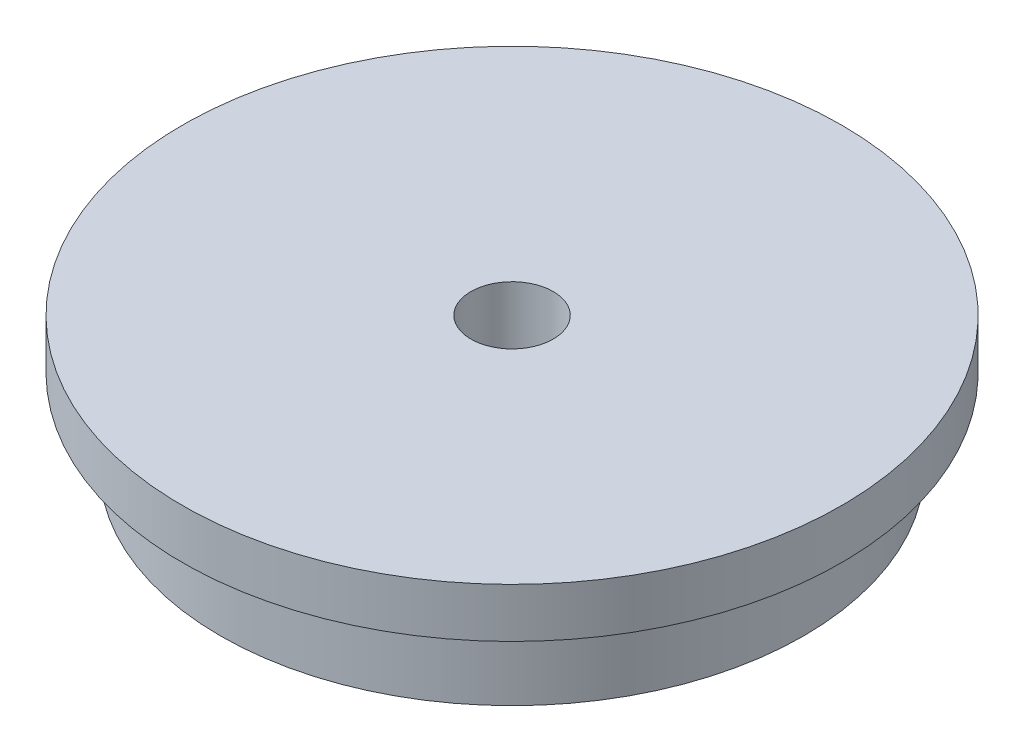
ISO-10303-21;
HEADER;
FILE_DESCRIPTION(('STEP AP214'),'2;1');
FILE_NAME('part.step','',(''),(''),'','','');
FILE_SCHEMA(('AUTOMOTIVE_DESIGN { 1 0 10303 214 1 1 1 1 }'));
ENDSEC;
DATA;
#1=APPLICATION_CONTEXT('core data for automotive mechanical design processes');
#2=APPLICATION_PROTOCOL_DEFINITION('international standard','automotive_design',2000,#1);
#3=PRODUCT_CONTEXT('',#1,'mechanical');
#4=PRODUCT('Part','Part','',(#3));
#5=PRODUCT_RELATED_PRODUCT_CATEGORY('part','',(#4));
#6=PRODUCT_DEFINITION_FORMATION('','',#4);
#7=PRODUCT_DEFINITION_CONTEXT('part definition',#1,'design');
#8=PRODUCT_DEFINITION('design','',#6,#7);
#9=PRODUCT_DEFINITION_SHAPE('','',#8);
#10=(LENGTH_UNIT() NAMED_UNIT(*) SI_UNIT(.MILLI.,.METRE.));
#11=(NAMED_UNIT(*) PLANE_ANGLE_UNIT() SI_UNIT($,.RADIAN.));
#12=(NAMED_UNIT(*) SI_UNIT($,.STERADIAN.) SOLID_ANGLE_UNIT());
#13=UNCERTAINTY_MEASURE_WITH_UNIT(LENGTH_MEASURE(1.E-05),#10,'distance_accuracy_value','');
#14=(GEOMETRIC_REPRESENTATION_CONTEXT(3) GLOBAL_UNCERTAINTY_ASSIGNED_CONTEXT((#13)) GLOBAL_UNIT_ASSIGNED_CONTEXT((#10,
#11,#12)) REPRESENTATION_CONTEXT('',''));
#15=CARTESIAN_POINT('',(0.,0.,0.));
#16=DIRECTION('',(0.,0.,1.));
#17=DIRECTION('',(1.,0.,0.));
#18=AXIS2_PLACEMENT_3D('',#15,#16,#17);
#19=CARTESIAN_POINT('',(0.,6.35,0.));
#20=DIRECTION('',(0.,-1.,0.));
#21=DIRECTION('',(0.,0.,-1.));
#22=AXIS2_PLACEMENT_3D('',#19,#20,#21);
#23=CYLINDRICAL_SURFACE('',#22,22.479);
#24=CARTESIAN_POINT('',(0.,6.35,0.));
#25=DIRECTION('',(0.,1.,0.));
#26=DIRECTION('',(0.,0.,1.));
#27=AXIS2_PLACEMENT_3D('',#24,#25,#26);
#28=CIRCLE('',#27,22.479);
#29=CARTESIAN_POINT('',(0.,6.35,22.479));
#30=VERTEX_POINT('',#29);
#31=EDGE_CURVE('E10',#30,#30,#28,.T.);
#32=ORIENTED_EDGE('',*,*,#31,.F.);
#33=EDGE_LOOP('',(#32));
#34=FACE_BOUND('',#33,.T.);
#35=CARTESIAN_POINT('',(0.,0.,0.));
#36=DIRECTION('',(0.,1.,0.));
#37=DIRECTION('',(0.,0.,1.));
#38=AXIS2_PLACEMENT_3D('',#35,#36,#37);
#39=CIRCLE('',#38,22.479);
#40=CARTESIAN_POINT('',(0.,0.,22.479));
#41=VERTEX_POINT('',#40);
#42=EDGE_CURVE('E42',#41,#41,#39,.T.);
#43=ORIENTED_EDGE('',*,*,#42,.T.);
#44=EDGE_LOOP('',(#43));
#45=FACE_BOUND('',#44,.T.);
#46=ADVANCED_FACE('F39',(#34,#45),#23,.T.);
#47=CARTESIAN_POINT('',(0.,0.,0.));
#48=DIRECTION('',(0.,1.,0.));
#49=DIRECTION('',(0.,0.,1.));
#50=AXIS2_PLACEMENT_3D('',#47,#48,#49);
#51=PLANE('',#50);
#52=CARTESIAN_POINT('',(0.,0.,0.));
#53=DIRECTION('',(0.,-1.,0.));
#54=DIRECTION('',(0.,0.,-1.));
#55=AXIS2_PLACEMENT_3D('',#52,#53,#54);
#56=CIRCLE('',#55,8.9916);
#57=CARTESIAN_POINT('',(0.,0.,-8.9916));
#58=VERTEX_POINT('',#57);
#59=EDGE_CURVE('E57',#58,#58,#56,.T.);
#60=ORIENTED_EDGE('',*,*,#59,.F.);
#61=EDGE_LOOP('',(#60));
#62=FACE_BOUND('',#61,.T.);
#63=ORIENTED_EDGE('',*,*,#42,.F.);
#64=EDGE_LOOP('',(#63));
#65=FACE_BOUND('',#64,.T.);
#66=ADVANCED_FACE('F91',(#62,#65),#51,.F.);
#67=CARTESIAN_POINT('',(0.,10.16,0.));
#68=DIRECTION('',(0.,-1.,0.));
#69=DIRECTION('',(0.,0.,-1.));
#70=AXIS2_PLACEMENT_3D('',#67,#68,#69);
#71=CYLINDRICAL_SURFACE('',#70,25.4);
#72=CARTESIAN_POINT('',(0.,10.16,0.));
#73=DIRECTION('',(0.,1.,0.));
#74=DIRECTION('',(0.,0.,1.));
#75=AXIS2_PLACEMENT_3D('',#72,#73,#74);
#76=CIRCLE('',#75,25.4);
#77=CARTESIAN_POINT('',(0.,10.16,-25.4));
#78=VERTEX_POINT('',#77);
#79=EDGE_CURVE('E49',#78,#78,#76,.T.);
#80=CARTESIAN_POINT('',(0.,6.35,0.));
#81=DIRECTION('',(0.,1.,0.));
#82=DIRECTION('',(0.,0.,1.));
#83=AXIS2_PLACEMENT_3D('',#80,#81,#82);
#84=CIRCLE('',#83,25.4);
#85=CARTESIAN_POINT('',(0.,6.35,-25.4));
#86=VERTEX_POINT('',#85);
#87=EDGE_CURVE('E51',#86,#86,#84,.T.);
#88=CARTESIAN_POINT('',(0.,10.16,-25.4));
#89=CARTESIAN_POINT('',(0.,10.1203125,-25.4));
#90=CARTESIAN_POINT('',(0.,10.080625,-25.4));
#91=CARTESIAN_POINT('',(0.,10.00125,-25.4));
#92=CARTESIAN_POINT('',(0.,9.9615625,-25.4));
#93=CARTESIAN_POINT('',(0.,9.8821875,-25.4));
#94=CARTESIAN_POINT('',(0.,9.8425,-25.4));
#95=CARTESIAN_POINT('',(0.,9.763125,-25.4));
#96=CARTESIAN_POINT('',(0.,9.7234375,-25.4));
#97=CARTESIAN_POINT('',(0.,9.6440625,-25.4));
#98=CARTESIAN_POINT('',(0.,9.604375,-25.4));
#99=CARTESIAN_POINT('',(0.,9.525,-25.4));
#100=CARTESIAN_POINT('',(0.,9.4853125,-25.4));
#101=CARTESIAN_POINT('',(0.,9.4059375,-25.4));
#102=CARTESIAN_POINT('',(0.,9.36625,-25.4));
#103=CARTESIAN_POINT('',(0.,9.286875,-25.4));
#104=CARTESIAN_POINT('',(0.,9.2471875,-25.4));
#105=CARTESIAN_POINT('',(0.,9.1678125,-25.4));
#106=CARTESIAN_POINT('',(0.,9.128125,-25.4));
#107=CARTESIAN_POINT('',(0.,9.04875,-25.4));
#108=CARTESIAN_POINT('',(0.,9.0090625,-25.4));
#109=CARTESIAN_POINT('',(0.,8.9296875,-25.4));
#110=CARTESIAN_POINT('',(0.,8.89,-25.4));
#111=CARTESIAN_POINT('',(0.,8.810625,-25.4));
#112=CARTESIAN_POINT('',(0.,8.7709375,-25.4));
#113=CARTESIAN_POINT('',(0.,8.6915625,-25.4));
#114=CARTESIAN_POINT('',(0.,8.651875,-25.4));
#115=CARTESIAN_POINT('',(0.,8.5725,-25.4));
#116=CARTESIAN_POINT('',(0.,8.5328125,-25.4));
#117=CARTESIAN_POINT('',(0.,8.4534375,-25.4));
#118=CARTESIAN_POINT('',(0.,8.41375,-25.4));
#119=CARTESIAN_POINT('',(0.,8.334375,-25.4));
#120=CARTESIAN_POINT('',(0.,8.2946875,-25.4));
#121=CARTESIAN_POINT('',(0.,8.2153125,-25.4));
#122=CARTESIAN_POINT('',(0.,8.175625,-25.4));
#123=CARTESIAN_POINT('',(0.,8.09625,-25.4));
#124=CARTESIAN_POINT('',(0.,8.0565625,-25.4));
#125=CARTESIAN_POINT('',(0.,7.9771875,-25.4));
#126=CARTESIAN_POINT('',(0.,7.9375,-25.4));
#127=CARTESIAN_POINT('',(0.,7.858125,-25.4));
#128=CARTESIAN_POINT('',(0.,7.8184375,-25.4));
#129=CARTESIAN_POINT('',(0.,7.7390625,-25.4));
#130=CARTESIAN_POINT('',(0.,7.699375,-25.4));
#131=CARTESIAN_POINT('',(0.,7.62,-25.4));
#132=CARTESIAN_POINT('',(0.,7.5803125,-25.4));
#133=CARTESIAN_POINT('',(0.,7.5009375,-25.4));
#134=CARTESIAN_POINT('',(0.,7.46125,-25.4));
#135=CARTESIAN_POINT('',(0.,7.381875,-25.4));
#136=CARTESIAN_POINT('',(0.,7.3421875,-25.4));
#137=CARTESIAN_POINT('',(0.,7.2628125,-25.4));
#138=CARTESIAN_POINT('',(0.,7.223125,-25.4));
#139=CARTESIAN_POINT('',(0.,7.14375,-25.4));
#140=CARTESIAN_POINT('',(0.,7.1040625,-25.4));
#141=CARTESIAN_POINT('',(0.,7.0246875,-25.4));
#142=CARTESIAN_POINT('',(0.,6.985,-25.4));
#143=CARTESIAN_POINT('',(0.,6.905625,-25.4));
#144=CARTESIAN_POINT('',(0.,6.8659375,-25.4));
#145=CARTESIAN_POINT('',(0.,6.7865625,-25.4));
#146=CARTESIAN_POINT('',(0.,6.746875,-25.4));
#147=CARTESIAN_POINT('',(0.,6.6675,-25.4));
#148=CARTESIAN_POINT('',(0.,6.6278125,-25.4));
#149=CARTESIAN_POINT('',(0.,6.5484375,-25.4));
#150=CARTESIAN_POINT('',(0.,6.50875,-25.4));
#151=CARTESIAN_POINT('',(0.,6.429375,-25.4));
#152=CARTESIAN_POINT('',(0.,6.3896875,-25.4));
#153=CARTESIAN_POINT('',(0.,6.35,-25.4));
#154=B_SPLINE_CURVE_WITH_KNOTS('',3,(#88,#89,#90,#91,#92,#93,#94,#95,#96,#97,#98,#99,#100,#101,
#102,#103,#104,#105,#106,#107,#108,#109,#110,#111,#112,#113,#114,#115,#116,#117,#118,#119,#120,
#121,#122,#123,#124,#125,#126,#127,#128,#129,#130,#131,#132,#133,#134,#135,#136,#137,#138,#139,
#140,#141,#142,#143,#144,#145,#146,#147,#148,#149,#150,#151,#152,#153),.UNSPECIFIED.,.F.,.F.,(4,
2,2,2,2,2,2,2,2,2,2,2,2,2,2,2,2,2,2,2,2,2,2,2,2,2,2,2,2,2,2,2,4),(0.,0.119062499999999,
0.238124999999999,0.3571875,0.476249999999999,0.595312499999999,0.714374999999998,
0.833437499999999,0.952499999999998,1.0715625,1.190625,1.3096875,1.42875,1.5478125,1.666875,
1.7859375,1.905,2.0240625,2.143125,2.2621875,2.38125,2.5003125,2.619375,2.7384375,2.8575,
2.9765625,3.095625,3.2146875,3.33375,3.4528125,3.571875,3.6909375,3.81),.UNSPECIFIED.);
#155=EDGE_CURVE('BSEAM94',#78,#86,#154,.T.);
#156=ORIENTED_EDGE('',*,*,#79,.F.);
#157=ORIENTED_EDGE('',*,*,#87,.T.);
#158=ORIENTED_EDGE('',*,*,#155,.T.);
#159=ORIENTED_EDGE('',*,*,#155,.F.);
#160=EDGE_LOOP('',(#156,#158,#157,#159));
#161=FACE_BOUND('',#160,.T.);
#162=ADVANCED_FACE('F94',(#161),#71,.T.);
#163=CARTESIAN_POINT('',(0.,10.16,0.));
#164=DIRECTION('',(0.,1.,0.));
#165=DIRECTION('',(0.,0.,1.));
#166=AXIS2_PLACEMENT_3D('',#163,#164,#165);
#167=PLANE('',#166);
#168=CARTESIAN_POINT('',(0.,10.16,0.));
#169=DIRECTION('',(0.,-1.,0.));
#170=DIRECTION('',(0.,0.,-1.));
#171=AXIS2_PLACEMENT_3D('',#168,#169,#170);
#172=CIRCLE('',#171,3.175);
#173=CARTESIAN_POINT('',(0.,10.16,-3.175));
#174=VERTEX_POINT('',#173);
#175=EDGE_CURVE('E60',#174,#174,#172,.T.);
#176=ORIENTED_EDGE('',*,*,#175,.T.);
#177=EDGE_LOOP('',(#176));
#178=FACE_BOUND('',#177,.T.);
#179=ORIENTED_EDGE('',*,*,#79,.T.);
#180=EDGE_LOOP('',(#179));
#181=FACE_BOUND('',#180,.T.);
#182=ADVANCED_FACE('F69',(#178,#181),#167,.T.);
#183=CARTESIAN_POINT('',(0.,6.35,0.));
#184=DIRECTION('',(0.,1.,0.));
#185=DIRECTION('',(0.,0.,1.));
#186=AXIS2_PLACEMENT_3D('',#183,#184,#185);
#187=PLANE('',#186);
#188=ORIENTED_EDGE('',*,*,#31,.T.);
#189=EDGE_LOOP('',(#188));
#190=FACE_BOUND('',#189,.T.);
#191=ORIENTED_EDGE('',*,*,#87,.F.);
#192=EDGE_LOOP('',(#191));
#193=FACE_BOUND('',#192,.T.);
#194=ADVANCED_FACE('F87',(#190,#193),#187,.F.);
#195=CARTESIAN_POINT('',(0.,3.81,0.));
#196=DIRECTION('',(0.,-1.,0.));
#197=DIRECTION('',(0.,0.,-1.));
#198=AXIS2_PLACEMENT_3D('',#195,#196,#197);
#199=CYLINDRICAL_SURFACE('',#198,8.9916);
#200=CARTESIAN_POINT('',(0.,3.81,0.));
#201=DIRECTION('',(0.,-1.,0.));
#202=DIRECTION('',(0.,0.,-1.));
#203=AXIS2_PLACEMENT_3D('',#200,#201,#202);
#204=CIRCLE('',#203,8.9916);
#205=CARTESIAN_POINT('',(0.,3.81,-8.9916));
#206=VERTEX_POINT('',#205);
#207=EDGE_CURVE('E54',#206,#206,#204,.T.);
#208=CARTESIAN_POINT('',(0.,3.81,-8.9916));
#209=CARTESIAN_POINT('',(0.,3.7703125,-8.9916));
#210=CARTESIAN_POINT('',(0.,3.730625,-8.9916));
#211=CARTESIAN_POINT('',(0.,3.65125,-8.9916));
#212=CARTESIAN_POINT('',(0.,3.6115625,-8.9916));
#213=CARTESIAN_POINT('',(0.,3.5321875,-8.9916));
#214=CARTESIAN_POINT('',(0.,3.4925,-8.9916));
#215=CARTESIAN_POINT('',(0.,3.413125,-8.9916));
#216=CARTESIAN_POINT('',(0.,3.3734375,-8.9916));
#217=CARTESIAN_POINT('',(0.,3.2940625,-8.9916));
#218=CARTESIAN_POINT('',(0.,3.254375,-8.9916));
#219=CARTESIAN_POINT('',(0.,3.175,-8.9916));
#220=CARTESIAN_POINT('',(0.,3.1353125,-8.9916));
#221=CARTESIAN_POINT('',(0.,3.0559375,-8.9916));
#222=CARTESIAN_POINT('',(0.,3.01625,-8.9916));
#223=CARTESIAN_POINT('',(0.,2.936875,-8.9916));
#224=CARTESIAN_POINT('',(0.,2.8971875,-8.9916));
#225=CARTESIAN_POINT('',(0.,2.8178125,-8.9916));
#226=CARTESIAN_POINT('',(0.,2.778125,-8.9916));
#227=CARTESIAN_POINT('',(0.,2.69875,-8.9916));
#228=CARTESIAN_POINT('',(0.,2.6590625,-8.9916));
#229=CARTESIAN_POINT('',(0.,2.5796875,-8.9916));
#230=CARTESIAN_POINT('',(0.,2.54,-8.9916));
#231=CARTESIAN_POINT('',(0.,2.460625,-8.9916));
#232=CARTESIAN_POINT('',(0.,2.4209375,-8.9916));
#233=CARTESIAN_POINT('',(0.,2.3415625,-8.9916));
#234=CARTESIAN_POINT('',(0.,2.301875,-8.9916));
#235=CARTESIAN_POINT('',(0.,2.2225,-8.9916));
#236=CARTESIAN_POINT('',(0.,2.1828125,-8.9916));
#237=CARTESIAN_POINT('',(0.,2.1034375,-8.9916));
#238=CARTESIAN_POINT('',(0.,2.06375,-8.9916));
#239=CARTESIAN_POINT('',(0.,1.984375,-8.9916));
#240=CARTESIAN_POINT('',(0.,1.9446875,-8.9916));
#241=CARTESIAN_POINT('',(0.,1.8653125,-8.9916));
#242=CARTESIAN_POINT('',(0.,1.825625,-8.9916));
#243=CARTESIAN_POINT('',(0.,1.74625,-8.9916));
#244=CARTESIAN_POINT('',(0.,1.7065625,-8.9916));
#245=CARTESIAN_POINT('',(0.,1.6271875,-8.9916));
#246=CARTESIAN_POINT('',(0.,1.5875,-8.9916));
#247=CARTESIAN_POINT('',(0.,1.508125,-8.9916));
#248=CARTESIAN_POINT('',(0.,1.4684375,-8.9916));
#249=CARTESIAN_POINT('',(0.,1.3890625,-8.9916));
#250=CARTESIAN_POINT('',(0.,1.349375,-8.9916));
#251=CARTESIAN_POINT('',(0.,1.27,-8.9916));
#252=CARTESIAN_POINT('',(0.,1.2303125,-8.9916));
#253=CARTESIAN_POINT('',(0.,1.1509375,-8.9916));
#254=CARTESIAN_POINT('',(0.,1.11125,-8.9916));
#255=CARTESIAN_POINT('',(0.,1.031875,-8.9916));
#256=CARTESIAN_POINT('',(0.,0.9921875,-8.9916));
#257=CARTESIAN_POINT('',(0.,0.9128125,-8.9916));
#258=CARTESIAN_POINT('',(0.,0.873125,-8.9916));
#259=CARTESIAN_POINT('',(0.,0.79375,-8.9916));
#260=CARTESIAN_POINT('',(0.,0.7540625,-8.9916));
#261=CARTESIAN_POINT('',(0.,0.6746875,-8.9916));
#262=CARTESIAN_POINT('',(0.,0.635,-8.9916));
#263=CARTESIAN_POINT('',(0.,0.555625,-8.9916));
#264=CARTESIAN_POINT('',(0.,0.5159375,-8.9916));
#265=CARTESIAN_POINT('',(0.,0.4365625,-8.9916));
#266=CARTESIAN_POINT('',(0.,0.396875,-8.9916));
#267=CARTESIAN_POINT('',(0.,0.3175,-8.9916));
#268=CARTESIAN_POINT('',(0.,0.2778125,-8.9916));
#269=CARTESIAN_POINT('',(0.,0.1984375,-8.9916));
#270=CARTESIAN_POINT('',(0.,0.15875,-8.9916));
#271=CARTESIAN_POINT('',(0.,0.0793749999999999,-8.9916));
#272=CARTESIAN_POINT('',(0.,0.0396874999999999,-8.9916));
#273=CARTESIAN_POINT('',(0.,0.,-8.9916));
#274=B_SPLINE_CURVE_WITH_KNOTS('',3,(#208,#209,#210,#211,#212,#213,#214,#215,#216,#217,#218,
#219,#220,#221,#222,#223,#224,#225,#226,#227,#228,#229,#230,#231,#232,#233,#234,#235,#236,#237,
#238,#239,#240,#241,#242,#243,#244,#245,#246,#247,#248,#249,#250,#251,#252,#253,#254,#255,#256,
#257,#258,#259,#260,#261,#262,#263,#264,#265,#266,#267,#268,#269,#270,#271,#272,#273),
.UNSPECIFIED.,.F.,.F.,(4,2,2,2,2,2,2,2,2,2,2,2,2,2,2,2,2,2,2,2,2,2,2,2,2,2,2,2,2,2,2,2,4),(0.,
0.1190625,0.238125,0.3571875,0.47625,0.5953125,0.714375,0.833437499999999,0.9525,1.0715625,
1.190625,1.3096875,1.42875,1.5478125,1.666875,1.7859375,1.905,2.0240625,2.143125,2.2621875,
2.38125,2.5003125,2.619375,2.7384375,2.8575,2.9765625,3.095625,3.2146875,3.33375,3.4528125,
3.571875,3.6909375,3.81),.UNSPECIFIED.);
#275=EDGE_CURVE('BSEAM81',#206,#58,#274,.T.);
#276=ORIENTED_EDGE('',*,*,#207,.F.);
#277=ORIENTED_EDGE('',*,*,#59,.T.);
#278=ORIENTED_EDGE('',*,*,#275,.T.);
#279=ORIENTED_EDGE('',*,*,#275,.F.);
#280=EDGE_LOOP('',(#276,#278,#277,#279));
#281=FACE_BOUND('',#280,.T.);
#282=ADVANCED_FACE('F81',(#281),#199,.F.);
#283=CARTESIAN_POINT('',(0.,3.81,0.));
#284=DIRECTION('',(0.,-1.,0.));
#285=DIRECTION('',(0.,0.,-1.));
#286=AXIS2_PLACEMENT_3D('',#283,#284,#285);
#287=PLANE('',#286);
#288=CARTESIAN_POINT('',(0.,3.81,0.));
#289=DIRECTION('',(0.,-1.,0.));
#290=DIRECTION('',(0.,0.,-1.));
#291=AXIS2_PLACEMENT_3D('',#288,#289,#290);
#292=CIRCLE('',#291,3.175);
#293=CARTESIAN_POINT('',(0.,3.81,-3.175));
#294=VERTEX_POINT('',#293);
#295=EDGE_CURVE('E63',#294,#294,#292,.T.);
#296=ORIENTED_EDGE('',*,*,#295,.F.);
#297=EDGE_LOOP('',(#296));
#298=FACE_BOUND('',#297,.T.);
#299=ORIENTED_EDGE('',*,*,#207,.T.);
#300=EDGE_LOOP('',(#299));
#301=FACE_BOUND('',#300,.T.);
#302=ADVANCED_FACE('F75',(#298,#301),#287,.T.);
#303=CARTESIAN_POINT('',(0.,10.16,0.));
#304=DIRECTION('',(0.,-1.,0.));
#305=DIRECTION('',(0.,0.,-1.));
#306=AXIS2_PLACEMENT_3D('',#303,#304,#305);
#307=CYLINDRICAL_SURFACE('',#306,3.175);
#308=ORIENTED_EDGE('',*,*,#175,.F.);
#309=EDGE_LOOP('',(#308));
#310=FACE_BOUND('',#309,.T.);
#311=ORIENTED_EDGE('',*,*,#295,.T.);
#312=EDGE_LOOP('',(#311));
#313=FACE_BOUND('',#312,.T.);
#314=ADVANCED_FACE('F72',(#310,#313),#307,.F.);
#315=CLOSED_SHELL('',(#46,#66,#162,#182,#194,#282,#302,#314));
#316=MANIFOLD_SOLID_BREP('B2',#315);
#317=ADVANCED_BREP_SHAPE_REPRESENTATION('',(#18,#316),#14);
#318=SHAPE_DEFINITION_REPRESENTATION(#9,#317);
ENDSEC;
END-ISO-10303-21;
